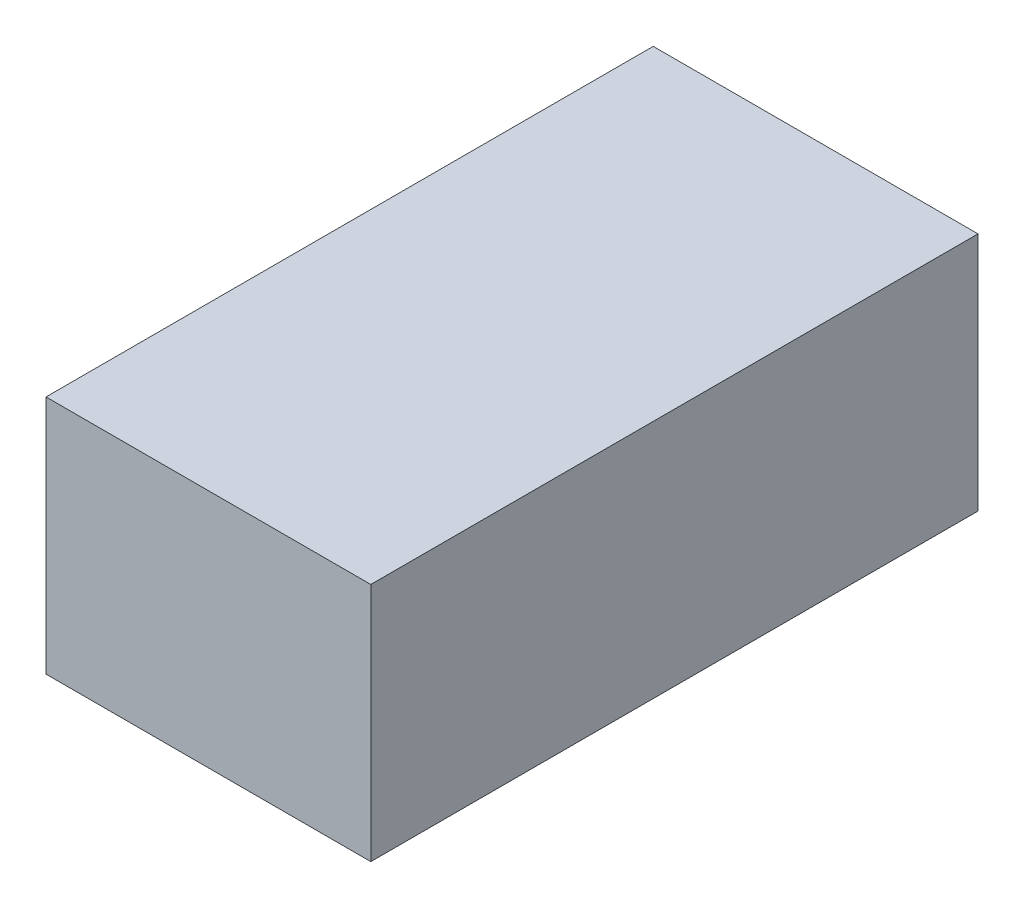
ISO-10303-21;
HEADER;
FILE_DESCRIPTION(('STEP AP214'),'2;1');
FILE_NAME('part.step','',(''),(''),'','','');
FILE_SCHEMA(('AUTOMOTIVE_DESIGN { 1 0 10303 214 1 1 1 1 }'));
ENDSEC;
DATA;
#1=APPLICATION_CONTEXT('core data for automotive mechanical design processes');
#2=APPLICATION_PROTOCOL_DEFINITION('international standard','automotive_design',2000,#1);
#3=PRODUCT_CONTEXT('',#1,'mechanical');
#4=PRODUCT('Part','Part','',(#3));
#5=PRODUCT_RELATED_PRODUCT_CATEGORY('part','',(#4));
#6=PRODUCT_DEFINITION_FORMATION('','',#4);
#7=PRODUCT_DEFINITION_CONTEXT('part definition',#1,'design');
#8=PRODUCT_DEFINITION('design','',#6,#7);
#9=PRODUCT_DEFINITION_SHAPE('','',#8);
#10=(LENGTH_UNIT() NAMED_UNIT(*) SI_UNIT(.MILLI.,.METRE.));
#11=(NAMED_UNIT(*) PLANE_ANGLE_UNIT() SI_UNIT($,.RADIAN.));
#12=(NAMED_UNIT(*) SI_UNIT($,.STERADIAN.) SOLID_ANGLE_UNIT());
#13=UNCERTAINTY_MEASURE_WITH_UNIT(LENGTH_MEASURE(1.E-05),#10,'distance_accuracy_value','');
#14=(GEOMETRIC_REPRESENTATION_CONTEXT(3) GLOBAL_UNCERTAINTY_ASSIGNED_CONTEXT((#13)) GLOBAL_UNIT_ASSIGNED_CONTEXT((#10,
#11,#12)) REPRESENTATION_CONTEXT('',''));
#15=CARTESIAN_POINT('',(0.,0.,0.));
#16=DIRECTION('',(0.,0.,1.));
#17=DIRECTION('',(1.,0.,0.));
#18=AXIS2_PLACEMENT_3D('',#15,#16,#17);
#19=CARTESIAN_POINT('',(0.,0.,43.));
#20=DIRECTION('',(1.,0.,0.));
#21=DIRECTION('',(0.,1.,0.));
#22=AXIS2_PLACEMENT_3D('',#19,#20,#21);
#23=PLANE('',#22);
#24=DIRECTION('',(0.,-1.,0.));
#25=VECTOR('',#24,1.);
#26=CARTESIAN_POINT('',(0.,0.,0.));
#27=LINE('',#26,#25);
#28=CARTESIAN_POINT('',(0.,17.,0.));
#29=VERTEX_POINT('',#28);
#30=CARTESIAN_POINT('',(0.,0.,0.));
#31=VERTEX_POINT('',#30);
#32=EDGE_CURVE('E94',#29,#31,#27,.T.);
#33=ORIENTED_EDGE('',*,*,#32,.T.);
#34=DIRECTION('',(0.,0.,-1.));
#35=VECTOR('',#34,1.);
#36=CARTESIAN_POINT('',(0.,0.,43.));
#37=LINE('',#36,#35);
#38=CARTESIAN_POINT('',(0.,0.,43.));
#39=VERTEX_POINT('',#38);
#40=EDGE_CURVE('E11',#39,#31,#37,.T.);
#41=ORIENTED_EDGE('',*,*,#40,.F.);
#42=DIRECTION('',(0.,-1.,0.));
#43=VECTOR('',#42,1.);
#44=CARTESIAN_POINT('',(0.,0.,43.));
#45=LINE('',#44,#43);
#46=CARTESIAN_POINT('',(0.,17.,43.));
#47=VERTEX_POINT('',#46);
#48=EDGE_CURVE('E82',#47,#39,#45,.T.);
#49=ORIENTED_EDGE('',*,*,#48,.F.);
#50=DIRECTION('',(0.,0.,-1.));
#51=VECTOR('',#50,1.);
#52=CARTESIAN_POINT('',(0.,17.,43.));
#53=LINE('',#52,#51);
#54=EDGE_CURVE('E90',#47,#29,#53,.T.);
#55=ORIENTED_EDGE('',*,*,#54,.T.);
#56=EDGE_LOOP('',(#33,#41,#49,#55));
#57=FACE_BOUND('',#56,.T.);
#58=ADVANCED_FACE('F31',(#57),#23,.F.);
#59=CARTESIAN_POINT('',(0.,0.,43.));
#60=DIRECTION('',(0.,1.,0.));
#61=DIRECTION('',(0.,0.,1.));
#62=AXIS2_PLACEMENT_3D('',#59,#60,#61);
#63=PLANE('',#62);
#64=DIRECTION('',(1.,0.,0.));
#65=VECTOR('',#64,1.);
#66=CARTESIAN_POINT('',(0.,0.,0.));
#67=LINE('',#66,#65);
#68=CARTESIAN_POINT('',(23.,0.,0.));
#69=VERTEX_POINT('',#68);
#70=EDGE_CURVE('E86',#31,#69,#67,.T.);
#71=ORIENTED_EDGE('',*,*,#70,.T.);
#72=DIRECTION('',(0.,0.,-1.));
#73=VECTOR('',#72,1.);
#74=CARTESIAN_POINT('',(23.,0.,43.));
#75=LINE('',#74,#73);
#76=CARTESIAN_POINT('',(23.,0.,43.));
#77=VERTEX_POINT('',#76);
#78=EDGE_CURVE('E39',#77,#69,#75,.T.);
#79=ORIENTED_EDGE('',*,*,#78,.F.);
#80=DIRECTION('',(1.,0.,0.));
#81=VECTOR('',#80,1.);
#82=CARTESIAN_POINT('',(0.,0.,43.));
#83=LINE('',#82,#81);
#84=EDGE_CURVE('E77',#39,#77,#83,.T.);
#85=ORIENTED_EDGE('',*,*,#84,.F.);
#86=ORIENTED_EDGE('',*,*,#40,.T.);
#87=EDGE_LOOP('',(#71,#79,#85,#86));
#88=FACE_BOUND('',#87,.T.);
#89=ADVANCED_FACE('F85',(#88),#63,.F.);
#90=CARTESIAN_POINT('',(23.,0.,43.));
#91=DIRECTION('',(-1.,0.,0.));
#92=DIRECTION('',(0.,-1.,0.));
#93=AXIS2_PLACEMENT_3D('',#90,#91,#92);
#94=PLANE('',#93);
#95=DIRECTION('',(0.,1.,0.));
#96=VECTOR('',#95,1.);
#97=CARTESIAN_POINT('',(23.,0.,0.));
#98=LINE('',#97,#96);
#99=CARTESIAN_POINT('',(23.,17.,0.));
#100=VERTEX_POINT('',#99);
#101=EDGE_CURVE('E64',#69,#100,#98,.T.);
#102=ORIENTED_EDGE('',*,*,#101,.T.);
#103=DIRECTION('',(0.,0.,-1.));
#104=VECTOR('',#103,1.);
#105=CARTESIAN_POINT('',(23.,17.,43.));
#106=LINE('',#105,#104);
#107=CARTESIAN_POINT('',(23.,17.,43.));
#108=VERTEX_POINT('',#107);
#109=EDGE_CURVE('E87',#108,#100,#106,.T.);
#110=ORIENTED_EDGE('',*,*,#109,.F.);
#111=DIRECTION('',(0.,1.,0.));
#112=VECTOR('',#111,1.);
#113=CARTESIAN_POINT('',(23.,0.,43.));
#114=LINE('',#113,#112);
#115=EDGE_CURVE('E80',#77,#108,#114,.T.);
#116=ORIENTED_EDGE('',*,*,#115,.F.);
#117=ORIENTED_EDGE('',*,*,#78,.T.);
#118=EDGE_LOOP('',(#102,#110,#116,#117));
#119=FACE_BOUND('',#118,.T.);
#120=ADVANCED_FACE('F88',(#119),#94,.F.);
#121=CARTESIAN_POINT('',(0.,17.,43.));
#122=DIRECTION('',(0.,-1.,0.));
#123=DIRECTION('',(0.,0.,-1.));
#124=AXIS2_PLACEMENT_3D('',#121,#122,#123);
#125=PLANE('',#124);
#126=DIRECTION('',(-1.,0.,0.));
#127=VECTOR('',#126,1.);
#128=CARTESIAN_POINT('',(0.,17.,0.));
#129=LINE('',#128,#127);
#130=EDGE_CURVE('E70',#100,#29,#129,.T.);
#131=ORIENTED_EDGE('',*,*,#130,.T.);
#132=ORIENTED_EDGE('',*,*,#54,.F.);
#133=DIRECTION('',(-1.,0.,0.));
#134=VECTOR('',#133,1.);
#135=CARTESIAN_POINT('',(0.,17.,43.));
#136=LINE('',#135,#134);
#137=EDGE_CURVE('E47',#108,#47,#136,.T.);
#138=ORIENTED_EDGE('',*,*,#137,.F.);
#139=ORIENTED_EDGE('',*,*,#109,.T.);
#140=EDGE_LOOP('',(#131,#132,#138,#139));
#141=FACE_BOUND('',#140,.T.);
#142=ADVANCED_FACE('F101',(#141),#125,.F.);
#143=CARTESIAN_POINT('',(0.,17.,43.));
#144=DIRECTION('',(0.,0.,-1.));
#145=DIRECTION('',(-1.,0.,0.));
#146=AXIS2_PLACEMENT_3D('',#143,#144,#145);
#147=PLANE('',#146);
#148=ORIENTED_EDGE('',*,*,#48,.T.);
#149=ORIENTED_EDGE('',*,*,#84,.T.);
#150=ORIENTED_EDGE('',*,*,#115,.T.);
#151=ORIENTED_EDGE('',*,*,#137,.T.);
#152=EDGE_LOOP('',(#148,#149,#150,#151));
#153=FACE_BOUND('',#152,.T.);
#154=ADVANCED_FACE('F78',(#153),#147,.F.);
#155=CARTESIAN_POINT('',(0.,17.,0.));
#156=DIRECTION('',(0.,0.,-1.));
#157=DIRECTION('',(-1.,0.,0.));
#158=AXIS2_PLACEMENT_3D('',#155,#156,#157);
#159=PLANE('',#158);
#160=ORIENTED_EDGE('',*,*,#32,.F.);
#161=ORIENTED_EDGE('',*,*,#130,.F.);
#162=ORIENTED_EDGE('',*,*,#101,.F.);
#163=ORIENTED_EDGE('',*,*,#70,.F.);
#164=EDGE_LOOP('',(#160,#161,#162,#163));
#165=FACE_BOUND('',#164,.T.);
#166=ADVANCED_FACE('F104',(#165),#159,.T.);
#167=CLOSED_SHELL('',(#58,#89,#120,#142,#154,#166));
#168=MANIFOLD_SOLID_BREP('B2',#167);
#169=ADVANCED_BREP_SHAPE_REPRESENTATION('',(#18,#168),#14);
#170=SHAPE_DEFINITION_REPRESENTATION(#9,#169);
ENDSEC;
END-ISO-10303-21;
